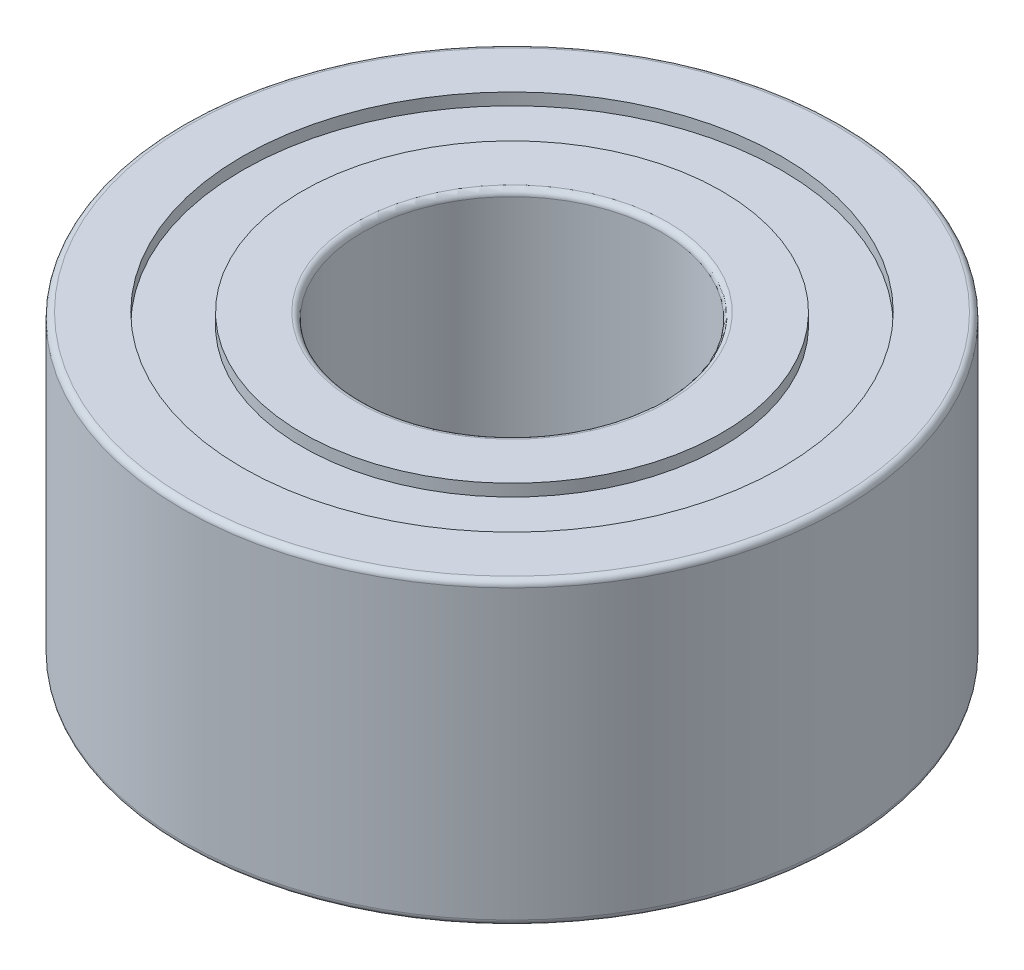
ISO-10303-21;
HEADER;
FILE_DESCRIPTION(('STEP AP214'),'2;1');
FILE_NAME('part.step','',(''),(''),'','','');
FILE_SCHEMA(('AUTOMOTIVE_DESIGN { 1 0 10303 214 1 1 1 1 }'));
ENDSEC;
DATA;
#1=APPLICATION_CONTEXT('core data for automotive mechanical design processes');
#2=APPLICATION_PROTOCOL_DEFINITION('international standard','automotive_design',2000,#1);
#3=PRODUCT_CONTEXT('',#1,'mechanical');
#4=PRODUCT('Part','Part','',(#3));
#5=PRODUCT_RELATED_PRODUCT_CATEGORY('part','',(#4));
#6=PRODUCT_DEFINITION_FORMATION('','',#4);
#7=PRODUCT_DEFINITION_CONTEXT('part definition',#1,'design');
#8=PRODUCT_DEFINITION('design','',#6,#7);
#9=PRODUCT_DEFINITION_SHAPE('','',#8);
#10=(LENGTH_UNIT() NAMED_UNIT(*) SI_UNIT(.MILLI.,.METRE.));
#11=(NAMED_UNIT(*) PLANE_ANGLE_UNIT() SI_UNIT($,.RADIAN.));
#12=(NAMED_UNIT(*) SI_UNIT($,.STERADIAN.) SOLID_ANGLE_UNIT());
#13=UNCERTAINTY_MEASURE_WITH_UNIT(LENGTH_MEASURE(1.E-05),#10,'distance_accuracy_value','');
#14=(GEOMETRIC_REPRESENTATION_CONTEXT(3) GLOBAL_UNCERTAINTY_ASSIGNED_CONTEXT((#13)) GLOBAL_UNIT_ASSIGNED_CONTEXT((#10,
#11,#12)) REPRESENTATION_CONTEXT('',''));
#15=CARTESIAN_POINT('',(0.,0.,0.));
#16=DIRECTION('',(0.,0.,1.));
#17=DIRECTION('',(1.,0.,0.));
#18=AXIS2_PLACEMENT_3D('',#15,#16,#17);
#19=CARTESIAN_POINT('',(0.,-2.25524475524475,0.));
#20=DIRECTION('',(0.,-1.,0.));
#21=DIRECTION('',(0.,0.,-1.));
#22=AXIS2_PLACEMENT_3D('',#19,#20,#21);
#23=CYLINDRICAL_SURFACE('',#22,3.5);
#24=CARTESIAN_POINT('',(0.,2.5,0.));
#25=DIRECTION('',(0.,-1.,0.));
#26=DIRECTION('',(0.,0.,-1.));
#27=AXIS2_PLACEMENT_3D('',#24,#25,#26);
#28=CIRCLE('',#27,3.5);
#29=CARTESIAN_POINT('',(0.,2.5,-3.5));
#30=VERTEX_POINT('',#29);
#31=EDGE_CURVE('E116',#30,#30,#28,.T.);
#32=ORIENTED_EDGE('',*,*,#31,.T.);
#33=EDGE_LOOP('',(#32));
#34=FACE_BOUND('',#33,.T.);
#35=CARTESIAN_POINT('',(0.,2.3,0.));
#36=DIRECTION('',(0.,-1.,0.));
#37=DIRECTION('',(0.,0.,-1.));
#38=AXIS2_PLACEMENT_3D('',#35,#36,#37);
#39=CIRCLE('',#38,3.5);
#40=CARTESIAN_POINT('',(0.,2.3,-3.5));
#41=VERTEX_POINT('',#40);
#42=EDGE_CURVE('E10',#41,#41,#39,.T.);
#43=ORIENTED_EDGE('',*,*,#42,.F.);
#44=EDGE_LOOP('',(#43));
#45=FACE_BOUND('',#44,.T.);
#46=ADVANCED_FACE('F49',(#34,#45),#23,.T.);
#47=CARTESIAN_POINT('',(0.,2.3,-3.5));
#48=DIRECTION('',(0.,1.,0.));
#49=DIRECTION('',(0.,0.,1.));
#50=AXIS2_PLACEMENT_3D('',#47,#48,#49);
#51=PLANE('',#50);
#52=ORIENTED_EDGE('',*,*,#42,.T.);
#53=EDGE_LOOP('',(#52));
#54=FACE_BOUND('',#53,.T.);
#55=CARTESIAN_POINT('',(0.,2.3,0.));
#56=DIRECTION('',(0.,-1.,0.));
#57=DIRECTION('',(0.,0.,-1.));
#58=AXIS2_PLACEMENT_3D('',#55,#56,#57);
#59=CIRCLE('',#58,4.5);
#60=CARTESIAN_POINT('',(0.,2.3,-4.5));
#61=VERTEX_POINT('',#60);
#62=EDGE_CURVE('E56',#61,#61,#59,.T.);
#63=ORIENTED_EDGE('',*,*,#62,.F.);
#64=EDGE_LOOP('',(#63));
#65=FACE_BOUND('',#64,.T.);
#66=ADVANCED_FACE('F135',(#54,#65),#51,.T.);
#67=CARTESIAN_POINT('',(0.,-2.25524475524475,0.));
#68=DIRECTION('',(0.,-1.,0.));
#69=DIRECTION('',(0.,0.,-1.));
#70=AXIS2_PLACEMENT_3D('',#67,#68,#69);
#71=CYLINDRICAL_SURFACE('',#70,4.5);
#72=ORIENTED_EDGE('',*,*,#62,.T.);
#73=EDGE_LOOP('',(#72));
#74=FACE_BOUND('',#73,.T.);
#75=CARTESIAN_POINT('',(0.,2.5,0.));
#76=DIRECTION('',(0.,-1.,0.));
#77=DIRECTION('',(0.,0.,-1.));
#78=AXIS2_PLACEMENT_3D('',#75,#76,#77);
#79=CIRCLE('',#78,4.5);
#80=CARTESIAN_POINT('',(0.,2.5,-4.5));
#81=VERTEX_POINT('',#80);
#82=EDGE_CURVE('E61',#81,#81,#79,.T.);
#83=ORIENTED_EDGE('',*,*,#82,.F.);
#84=EDGE_LOOP('',(#83));
#85=FACE_BOUND('',#84,.T.);
#86=ADVANCED_FACE('F140',(#74,#85),#71,.F.);
#87=CARTESIAN_POINT('',(0.,2.5,-4.5));
#88=DIRECTION('',(0.,1.,0.));
#89=DIRECTION('',(0.,0.,1.));
#90=AXIS2_PLACEMENT_3D('',#87,#88,#89);
#91=PLANE('',#90);
#92=ORIENTED_EDGE('',*,*,#82,.T.);
#93=EDGE_LOOP('',(#92));
#94=FACE_BOUND('',#93,.T.);
#95=CARTESIAN_POINT('',(0.,2.5,0.));
#96=DIRECTION('',(0.,-1.,0.));
#97=DIRECTION('',(0.,0.,-1.));
#98=AXIS2_PLACEMENT_3D('',#95,#96,#97);
#99=CIRCLE('',#98,5.4);
#100=CARTESIAN_POINT('',(0.,2.5,-5.4));
#101=VERTEX_POINT('',#100);
#102=EDGE_CURVE('E66',#101,#101,#99,.T.);
#103=ORIENTED_EDGE('',*,*,#102,.F.);
#104=EDGE_LOOP('',(#103));
#105=FACE_BOUND('',#104,.T.);
#106=ADVANCED_FACE('F145',(#94,#105),#91,.T.);
#107=CARTESIAN_POINT('',(0.,2.4,0.));
#108=DIRECTION('',(0.,-1.,0.));
#109=DIRECTION('',(0.,0.,-1.));
#110=AXIS2_PLACEMENT_3D('',#107,#108,#109);
#111=TOROIDAL_SURFACE('',#110,5.4,0.1);
#112=ORIENTED_EDGE('',*,*,#102,.T.);
#113=EDGE_LOOP('',(#112));
#114=FACE_BOUND('',#113,.T.);
#115=CARTESIAN_POINT('',(0.,2.4,0.));
#116=DIRECTION('',(0.,-1.,0.));
#117=DIRECTION('',(0.,0.,-1.));
#118=AXIS2_PLACEMENT_3D('',#115,#116,#117);
#119=CIRCLE('',#118,5.5);
#120=CARTESIAN_POINT('',(0.,2.4,-5.5));
#121=VERTEX_POINT('',#120);
#122=EDGE_CURVE('E72',#121,#121,#119,.T.);
#123=ORIENTED_EDGE('',*,*,#122,.F.);
#124=EDGE_LOOP('',(#123));
#125=FACE_BOUND('',#124,.T.);
#126=ADVANCED_FACE('F151',(#114,#125),#111,.T.);
#127=CARTESIAN_POINT('',(0.,-2.25524475524475,0.));
#128=DIRECTION('',(0.,-1.,0.));
#129=DIRECTION('',(0.,0.,-1.));
#130=AXIS2_PLACEMENT_3D('',#127,#128,#129);
#131=CYLINDRICAL_SURFACE('',#130,5.5);
#132=ORIENTED_EDGE('',*,*,#122,.T.);
#133=EDGE_LOOP('',(#132));
#134=FACE_BOUND('',#133,.T.);
#135=CARTESIAN_POINT('',(0.,-2.4,0.));
#136=DIRECTION('',(0.,-1.,0.));
#137=DIRECTION('',(0.,0.,-1.));
#138=AXIS2_PLACEMENT_3D('',#135,#136,#137);
#139=CIRCLE('',#138,5.5);
#140=CARTESIAN_POINT('',(0.,-2.4,-5.5));
#141=VERTEX_POINT('',#140);
#142=EDGE_CURVE('E76',#141,#141,#139,.T.);
#143=ORIENTED_EDGE('',*,*,#142,.F.);
#144=EDGE_LOOP('',(#143));
#145=FACE_BOUND('',#144,.T.);
#146=ADVANCED_FACE('F155',(#134,#145),#131,.T.);
#147=CARTESIAN_POINT('',(0.,-2.4,0.));
#148=DIRECTION('',(0.,-1.,0.));
#149=DIRECTION('',(0.,0.,-1.));
#150=AXIS2_PLACEMENT_3D('',#147,#148,#149);
#151=TOROIDAL_SURFACE('',#150,5.4,0.1);
#152=ORIENTED_EDGE('',*,*,#142,.T.);
#153=EDGE_LOOP('',(#152));
#154=FACE_BOUND('',#153,.T.);
#155=CARTESIAN_POINT('',(0.,-2.5,0.));
#156=DIRECTION('',(0.,-1.,0.));
#157=DIRECTION('',(0.,0.,-1.));
#158=AXIS2_PLACEMENT_3D('',#155,#156,#157);
#159=CIRCLE('',#158,5.4);
#160=CARTESIAN_POINT('',(0.,-2.5,-5.4));
#161=VERTEX_POINT('',#160);
#162=EDGE_CURVE('E80',#161,#161,#159,.T.);
#163=ORIENTED_EDGE('',*,*,#162,.F.);
#164=EDGE_LOOP('',(#163));
#165=FACE_BOUND('',#164,.T.);
#166=ADVANCED_FACE('F159',(#154,#165),#151,.T.);
#167=CARTESIAN_POINT('',(0.,-2.5,-5.4));
#168=DIRECTION('',(0.,-1.,0.));
#169=DIRECTION('',(0.,0.,-1.));
#170=AXIS2_PLACEMENT_3D('',#167,#168,#169);
#171=PLANE('',#170);
#172=ORIENTED_EDGE('',*,*,#162,.T.);
#173=EDGE_LOOP('',(#172));
#174=FACE_BOUND('',#173,.T.);
#175=CARTESIAN_POINT('',(0.,-2.5,0.));
#176=DIRECTION('',(0.,-1.,0.));
#177=DIRECTION('',(0.,0.,-1.));
#178=AXIS2_PLACEMENT_3D('',#175,#176,#177);
#179=CIRCLE('',#178,4.77957459207459);
#180=CARTESIAN_POINT('',(0.,-2.5,-4.77957459207459));
#181=VERTEX_POINT('',#180);
#182=EDGE_CURVE('E84',#181,#181,#179,.T.);
#183=ORIENTED_EDGE('',*,*,#182,.F.);
#184=EDGE_LOOP('',(#183));
#185=FACE_BOUND('',#184,.T.);
#186=ADVANCED_FACE('F163',(#174,#185),#171,.T.);
#187=CARTESIAN_POINT('',(0.,-2.25524475524475,0.));
#188=DIRECTION('',(0.,-1.,0.));
#189=DIRECTION('',(0.,0.,-1.));
#190=AXIS2_PLACEMENT_3D('',#187,#188,#189);
#191=CYLINDRICAL_SURFACE('',#190,4.77957459207459);
#192=ORIENTED_EDGE('',*,*,#182,.T.);
#193=EDGE_LOOP('',(#192));
#194=FACE_BOUND('',#193,.T.);
#195=CARTESIAN_POINT('',(0.,-2.3,0.));
#196=DIRECTION('',(0.,-1.,0.));
#197=DIRECTION('',(0.,0.,-1.));
#198=AXIS2_PLACEMENT_3D('',#195,#196,#197);
#199=CIRCLE('',#198,4.77957459207459);
#200=CARTESIAN_POINT('',(0.,-2.3,-4.77957459207459));
#201=VERTEX_POINT('',#200);
#202=EDGE_CURVE('E88',#201,#201,#199,.T.);
#203=ORIENTED_EDGE('',*,*,#202,.F.);
#204=EDGE_LOOP('',(#203));
#205=FACE_BOUND('',#204,.T.);
#206=ADVANCED_FACE('F167',(#194,#205),#191,.F.);
#207=CARTESIAN_POINT('',(0.,-2.3,-4.77957459207459));
#208=DIRECTION('',(0.,-1.,0.));
#209=DIRECTION('',(0.,0.,-1.));
#210=AXIS2_PLACEMENT_3D('',#207,#208,#209);
#211=PLANE('',#210);
#212=ORIENTED_EDGE('',*,*,#202,.T.);
#213=EDGE_LOOP('',(#212));
#214=FACE_BOUND('',#213,.T.);
#215=CARTESIAN_POINT('',(0.,-2.3,0.));
#216=DIRECTION('',(0.,-1.,0.));
#217=DIRECTION('',(0.,0.,-1.));
#218=AXIS2_PLACEMENT_3D('',#215,#216,#217);
#219=CIRCLE('',#218,3.22042540792541);
#220=CARTESIAN_POINT('',(0.,-2.3,-3.22042540792541));
#221=VERTEX_POINT('',#220);
#222=EDGE_CURVE('E92',#221,#221,#219,.T.);
#223=ORIENTED_EDGE('',*,*,#222,.F.);
#224=EDGE_LOOP('',(#223));
#225=FACE_BOUND('',#224,.T.);
#226=ADVANCED_FACE('F171',(#214,#225),#211,.T.);
#227=CARTESIAN_POINT('',(0.,-2.25524475524475,0.));
#228=DIRECTION('',(0.,-1.,0.));
#229=DIRECTION('',(0.,0.,-1.));
#230=AXIS2_PLACEMENT_3D('',#227,#228,#229);
#231=CYLINDRICAL_SURFACE('',#230,3.22042540792541);
#232=ORIENTED_EDGE('',*,*,#222,.T.);
#233=EDGE_LOOP('',(#232));
#234=FACE_BOUND('',#233,.T.);
#235=CARTESIAN_POINT('',(0.,-2.5,0.));
#236=DIRECTION('',(0.,-1.,0.));
#237=DIRECTION('',(0.,0.,-1.));
#238=AXIS2_PLACEMENT_3D('',#235,#236,#237);
#239=CIRCLE('',#238,3.22042540792541);
#240=CARTESIAN_POINT('',(0.,-2.5,-3.22042540792541));
#241=VERTEX_POINT('',#240);
#242=EDGE_CURVE('E96',#241,#241,#239,.T.);
#243=ORIENTED_EDGE('',*,*,#242,.F.);
#244=EDGE_LOOP('',(#243));
#245=FACE_BOUND('',#244,.T.);
#246=ADVANCED_FACE('F174',(#234,#245),#231,.T.);
#247=CARTESIAN_POINT('',(0.,-2.5,-3.22042540792541));
#248=DIRECTION('',(0.,-1.,0.));
#249=DIRECTION('',(0.,0.,-1.));
#250=AXIS2_PLACEMENT_3D('',#247,#248,#249);
#251=PLANE('',#250);
#252=ORIENTED_EDGE('',*,*,#242,.T.);
#253=EDGE_LOOP('',(#252));
#254=FACE_BOUND('',#253,.T.);
#255=CARTESIAN_POINT('',(0.,-2.5,0.));
#256=DIRECTION('',(0.,-1.,0.));
#257=DIRECTION('',(0.,0.,-1.));
#258=AXIS2_PLACEMENT_3D('',#255,#256,#257);
#259=CIRCLE('',#258,2.6);
#260=CARTESIAN_POINT('',(0.,-2.5,-2.6));
#261=VERTEX_POINT('',#260);
#262=EDGE_CURVE('E100',#261,#261,#259,.T.);
#263=ORIENTED_EDGE('',*,*,#262,.F.);
#264=EDGE_LOOP('',(#263));
#265=FACE_BOUND('',#264,.T.);
#266=ADVANCED_FACE('F178',(#254,#265),#251,.T.);
#267=CARTESIAN_POINT('',(0.,-2.4,0.));
#268=DIRECTION('',(0.,-1.,0.));
#269=DIRECTION('',(0.,0.,-1.));
#270=AXIS2_PLACEMENT_3D('',#267,#268,#269);
#271=TOROIDAL_SURFACE('',#270,2.6,0.1);
#272=ORIENTED_EDGE('',*,*,#262,.T.);
#273=EDGE_LOOP('',(#272));
#274=FACE_BOUND('',#273,.T.);
#275=CARTESIAN_POINT('',(0.,-2.4,0.));
#276=DIRECTION('',(0.,-1.,0.));
#277=DIRECTION('',(0.,0.,-1.));
#278=AXIS2_PLACEMENT_3D('',#275,#276,#277);
#279=CIRCLE('',#278,2.5);
#280=CARTESIAN_POINT('',(0.,-2.4,-2.5));
#281=VERTEX_POINT('',#280);
#282=EDGE_CURVE('E104',#281,#281,#279,.T.);
#283=ORIENTED_EDGE('',*,*,#282,.F.);
#284=EDGE_LOOP('',(#283));
#285=FACE_BOUND('',#284,.T.);
#286=ADVANCED_FACE('F182',(#274,#285),#271,.T.);
#287=CARTESIAN_POINT('',(0.,-2.25524475524475,0.));
#288=DIRECTION('',(0.,-1.,0.));
#289=DIRECTION('',(0.,0.,-1.));
#290=AXIS2_PLACEMENT_3D('',#287,#288,#289);
#291=CYLINDRICAL_SURFACE('',#290,2.5);
#292=ORIENTED_EDGE('',*,*,#282,.T.);
#293=EDGE_LOOP('',(#292));
#294=FACE_BOUND('',#293,.T.);
#295=CARTESIAN_POINT('',(0.,2.4,0.));
#296=DIRECTION('',(0.,-1.,0.));
#297=DIRECTION('',(0.,0.,-1.));
#298=AXIS2_PLACEMENT_3D('',#295,#296,#297);
#299=CIRCLE('',#298,2.5);
#300=CARTESIAN_POINT('',(0.,2.4,-2.5));
#301=VERTEX_POINT('',#300);
#302=EDGE_CURVE('E108',#301,#301,#299,.T.);
#303=ORIENTED_EDGE('',*,*,#302,.F.);
#304=EDGE_LOOP('',(#303));
#305=FACE_BOUND('',#304,.T.);
#306=ADVANCED_FACE('F131',(#294,#305),#291,.F.);
#307=CARTESIAN_POINT('',(0.,2.4,0.));
#308=DIRECTION('',(0.,-1.,0.));
#309=DIRECTION('',(0.,0.,-1.));
#310=AXIS2_PLACEMENT_3D('',#307,#308,#309);
#311=TOROIDAL_SURFACE('',#310,2.6,0.0999999999999998);
#312=ORIENTED_EDGE('',*,*,#302,.T.);
#313=EDGE_LOOP('',(#312));
#314=FACE_BOUND('',#313,.T.);
#315=CARTESIAN_POINT('',(0.,2.5,0.));
#316=DIRECTION('',(0.,-1.,0.));
#317=DIRECTION('',(0.,0.,-1.));
#318=AXIS2_PLACEMENT_3D('',#315,#316,#317);
#319=CIRCLE('',#318,2.6);
#320=CARTESIAN_POINT('',(0.,2.5,-2.6));
#321=VERTEX_POINT('',#320);
#322=EDGE_CURVE('E112',#321,#321,#319,.T.);
#323=ORIENTED_EDGE('',*,*,#322,.F.);
#324=EDGE_LOOP('',(#323));
#325=FACE_BOUND('',#324,.T.);
#326=ADVANCED_FACE('F125',(#314,#325),#311,.T.);
#327=CARTESIAN_POINT('',(0.,2.5,-2.6));
#328=DIRECTION('',(0.,1.,0.));
#329=DIRECTION('',(0.,0.,1.));
#330=AXIS2_PLACEMENT_3D('',#327,#328,#329);
#331=PLANE('',#330);
#332=ORIENTED_EDGE('',*,*,#322,.T.);
#333=EDGE_LOOP('',(#332));
#334=FACE_BOUND('',#333,.T.);
#335=ORIENTED_EDGE('',*,*,#31,.F.);
#336=EDGE_LOOP('',(#335));
#337=FACE_BOUND('',#336,.T.);
#338=ADVANCED_FACE('F123',(#334,#337),#331,.T.);
#339=CLOSED_SHELL('',(#46,#66,#86,#106,#126,#146,#166,#186,#206,#226,#246,#266,#286,#306,#326,#338));
#340=MANIFOLD_SOLID_BREP('B2',#339);
#341=ADVANCED_BREP_SHAPE_REPRESENTATION('',(#18,#340),#14);
#342=SHAPE_DEFINITION_REPRESENTATION(#9,#341);
ENDSEC;
END-ISO-10303-21;
